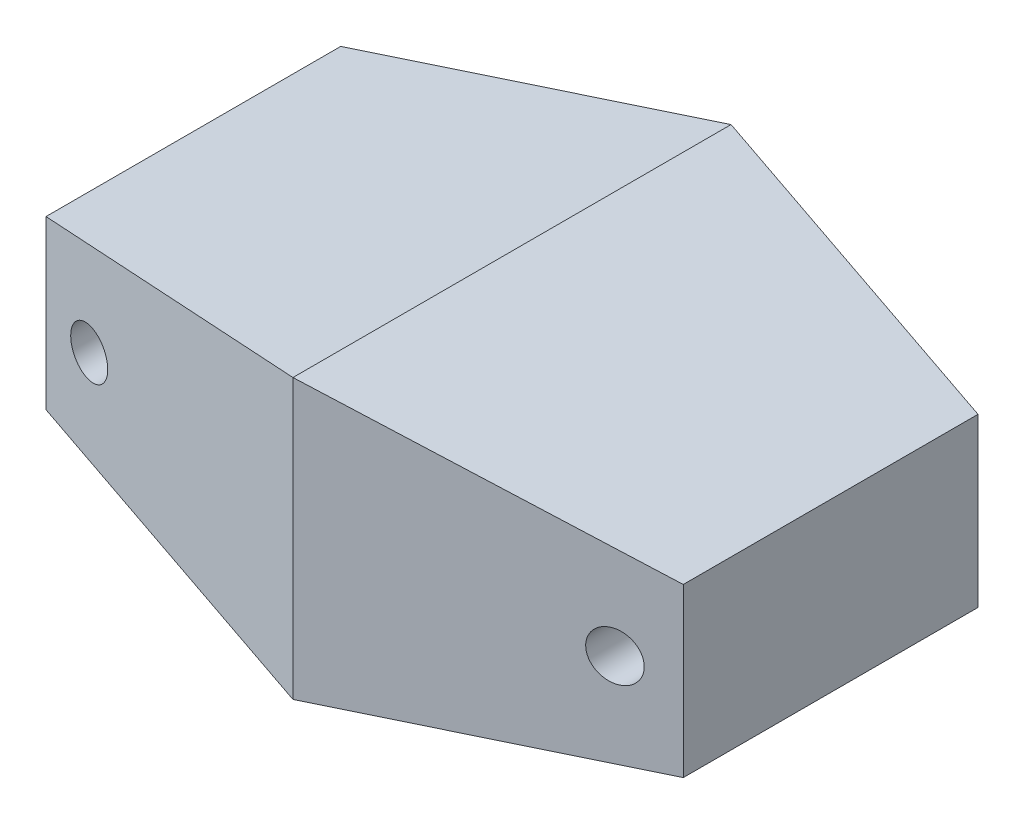
ISO-10303-21;
HEADER;
FILE_DESCRIPTION(('STEP AP214'),'2;1');
FILE_NAME('part.step','',(''),(''),'','','');
FILE_SCHEMA(('AUTOMOTIVE_DESIGN { 1 0 10303 214 1 1 1 1 }'));
ENDSEC;
DATA;
#1=APPLICATION_CONTEXT('core data for automotive mechanical design processes');
#2=APPLICATION_PROTOCOL_DEFINITION('international standard','automotive_design',2000,#1);
#3=PRODUCT_CONTEXT('',#1,'mechanical');
#4=PRODUCT('Part','Part','',(#3));
#5=PRODUCT_RELATED_PRODUCT_CATEGORY('part','',(#4));
#6=PRODUCT_DEFINITION_FORMATION('','',#4);
#7=PRODUCT_DEFINITION_CONTEXT('part definition',#1,'design');
#8=PRODUCT_DEFINITION('design','',#6,#7);
#9=PRODUCT_DEFINITION_SHAPE('','',#8);
#10=(LENGTH_UNIT() NAMED_UNIT(*) SI_UNIT(.MILLI.,.METRE.));
#11=(NAMED_UNIT(*) PLANE_ANGLE_UNIT() SI_UNIT($,.RADIAN.));
#12=(NAMED_UNIT(*) SI_UNIT($,.STERADIAN.) SOLID_ANGLE_UNIT());
#13=UNCERTAINTY_MEASURE_WITH_UNIT(LENGTH_MEASURE(1.E-05),#10,'distance_accuracy_value','');
#14=(GEOMETRIC_REPRESENTATION_CONTEXT(3) GLOBAL_UNCERTAINTY_ASSIGNED_CONTEXT((#13)) GLOBAL_UNIT_ASSIGNED_CONTEXT((#10,
#11,#12)) REPRESENTATION_CONTEXT('',''));
#15=CARTESIAN_POINT('',(0.,0.,0.));
#16=DIRECTION('',(0.,0.,1.));
#17=DIRECTION('',(1.,0.,0.));
#18=AXIS2_PLACEMENT_3D('',#15,#16,#17);
#19=CARTESIAN_POINT('',(40.,-17.5,55.));
#20=DIRECTION('',(-1.,0.,0.));
#21=DIRECTION('',(0.,0.,1.));
#22=AXIS2_PLACEMENT_3D('',#19,#20,#21);
#23=PLANE('',#22);
#24=DIRECTION('',(0.,1.,0.));
#25=VECTOR('',#24,1.);
#26=CARTESIAN_POINT('',(40.,-37.5,46.));
#27=LINE('',#26,#25);
#28=CARTESIAN_POINT('',(40.,-10.5,46.));
#29=VERTEX_POINT('',#28);
#30=CARTESIAN_POINT('',(40.,10.5,46.));
#31=VERTEX_POINT('',#30);
#32=EDGE_CURVE('E305',#29,#31,#27,.T.);
#33=ORIENTED_EDGE('',*,*,#32,.F.);
#34=DIRECTION('',(0.,0.,-1.));
#35=VECTOR('',#34,1.);
#36=CARTESIAN_POINT('',(40.,-10.5,55.));
#37=LINE('',#36,#35);
#38=CARTESIAN_POINT('',(40.,-10.5,9.00000000000001));
#39=VERTEX_POINT('',#38);
#40=EDGE_CURVE('E272',#29,#39,#37,.T.);
#41=ORIENTED_EDGE('',*,*,#40,.T.);
#42=DIRECTION('',(0.,1.,0.));
#43=VECTOR('',#42,1.);
#44=CARTESIAN_POINT('',(40.,-37.5,9.00000000000001));
#45=LINE('',#44,#43);
#46=CARTESIAN_POINT('',(40.,10.5,9.00000000000001));
#47=VERTEX_POINT('',#46);
#48=EDGE_CURVE('E165',#39,#47,#45,.T.);
#49=ORIENTED_EDGE('',*,*,#48,.T.);
#50=DIRECTION('',(0.,0.,-1.));
#51=VECTOR('',#50,1.);
#52=CARTESIAN_POINT('',(40.,10.5,55.));
#53=LINE('',#52,#51);
#54=EDGE_CURVE('E216',#31,#47,#53,.T.);
#55=ORIENTED_EDGE('',*,*,#54,.F.);
#56=EDGE_LOOP('',(#33,#41,#49,#55));
#57=FACE_BOUND('',#56,.T.);
#58=ADVANCED_FACE('F148',(#57),#23,.F.);
#59=CARTESIAN_POINT('',(-40.,-17.5,55.));
#60=DIRECTION('',(1.,0.,0.));
#61=DIRECTION('',(0.,0.,-1.));
#62=AXIS2_PLACEMENT_3D('',#59,#60,#61);
#63=PLANE('',#62);
#64=DIRECTION('',(0.,1.,0.));
#65=VECTOR('',#64,1.);
#66=CARTESIAN_POINT('',(-40.,-37.5,46.));
#67=LINE('',#66,#65);
#68=CARTESIAN_POINT('',(-40.,-10.5,46.));
#69=VERTEX_POINT('',#68);
#70=CARTESIAN_POINT('',(-40.,10.5,46.));
#71=VERTEX_POINT('',#70);
#72=EDGE_CURVE('E238',#69,#71,#67,.T.);
#73=ORIENTED_EDGE('',*,*,#72,.T.);
#74=DIRECTION('',(0.,0.,-1.));
#75=VECTOR('',#74,1.);
#76=CARTESIAN_POINT('',(-40.,10.5,55.));
#77=LINE('',#76,#75);
#78=CARTESIAN_POINT('',(-40.,10.5,8.99999999999999));
#79=VERTEX_POINT('',#78);
#80=EDGE_CURVE('E269',#71,#79,#77,.T.);
#81=ORIENTED_EDGE('',*,*,#80,.T.);
#82=DIRECTION('',(0.,1.,0.));
#83=VECTOR('',#82,1.);
#84=CARTESIAN_POINT('',(-40.,-37.5,8.99999999999999));
#85=LINE('',#84,#83);
#86=CARTESIAN_POINT('',(-40.,-10.5,8.99999999999999));
#87=VERTEX_POINT('',#86);
#88=EDGE_CURVE('E226',#87,#79,#85,.T.);
#89=ORIENTED_EDGE('',*,*,#88,.F.);
#90=DIRECTION('',(0.,0.,-1.));
#91=VECTOR('',#90,1.);
#92=CARTESIAN_POINT('',(-40.,-10.5,55.));
#93=LINE('',#92,#91);
#94=EDGE_CURVE('E228',#69,#87,#93,.T.);
#95=ORIENTED_EDGE('',*,*,#94,.F.);
#96=EDGE_LOOP('',(#73,#81,#89,#95));
#97=FACE_BOUND('',#96,.T.);
#98=ADVANCED_FACE('F316',(#97),#63,.F.);
#99=CARTESIAN_POINT('',(0.,-37.5,0.));
#100=DIRECTION('',(-0.219512195121951,0.,-0.975609756097561));
#101=DIRECTION('',(-0.975609756097561,0.,0.219512195121951));
#102=AXIS2_PLACEMENT_3D('',#99,#100,#101);
#103=PLANE('',#102);
#104=CARTESIAN_POINT('',(-33.,0.,7.42499999999999));
#105=DIRECTION('',(-0.219512195121951,0.,-0.975609756097561));
#106=DIRECTION('',(-0.975609756097561,0.,0.219512195121951));
#107=AXIS2_PLACEMENT_3D('',#104,#105,#106);
#108=ELLIPSE('',#107,3.075,3.);
#109=CARTESIAN_POINT('',(-36.,0.,8.09999999999999));
#110=VERTEX_POINT('',#109);
#111=EDGE_CURVE('E263',#110,#110,#108,.T.);
#112=ORIENTED_EDGE('',*,*,#111,.F.);
#113=EDGE_LOOP('',(#112));
#114=FACE_BOUND('',#113,.T.);
#115=DIRECTION('',(-0.96169407366869,-0.168296462892021,0.216381166575455));
#116=VECTOR('',#115,1.);
#117=CARTESIAN_POINT('',(-8.90173410404625,15.9421965317919,2.0028901734104));
#118=LINE('',#117,#116);
#119=CARTESIAN_POINT('',(0.,17.5,0.));
#120=VERTEX_POINT('',#119);
#121=EDGE_CURVE('E207',#120,#79,#118,.T.);
#122=ORIENTED_EDGE('',*,*,#121,.F.);
#123=DIRECTION('',(0.,1.,0.));
#124=VECTOR('',#123,1.);
#125=CARTESIAN_POINT('',(0.,0.,0.));
#126=LINE('',#125,#124);
#127=CARTESIAN_POINT('',(0.,-17.5,0.));
#128=VERTEX_POINT('',#127);
#129=EDGE_CURVE('E224',#128,#120,#126,.T.);
#130=ORIENTED_EDGE('',*,*,#129,.F.);
#131=DIRECTION('',(-0.96169407366869,0.16829646289202,0.216381166575455));
#132=VECTOR('',#131,1.);
#133=CARTESIAN_POINT('',(3.23699421965317,-18.0664739884393,-0.728323699421962));
#134=LINE('',#133,#132);
#135=EDGE_CURVE('E297',#128,#87,#134,.T.);
#136=ORIENTED_EDGE('',*,*,#135,.T.);
#137=ORIENTED_EDGE('',*,*,#88,.T.);
#138=EDGE_LOOP('',(#122,#130,#136,#137));
#139=FACE_BOUND('',#138,.T.);
#140=ADVANCED_FACE('F221',(#114,#139),#103,.T.);
#141=CARTESIAN_POINT('',(-11.7787031528852,-37.5,52.3497917906008));
#142=DIRECTION('',(0.219512195121951,0.,-0.975609756097561));
#143=DIRECTION('',(-0.975609756097561,0.,-0.219512195121951));
#144=AXIS2_PLACEMENT_3D('',#141,#142,#143);
#145=PLANE('',#144);
#146=CARTESIAN_POINT('',(-33.,0.,47.575));
#147=DIRECTION('',(0.219512195121951,0.,-0.975609756097561));
#148=DIRECTION('',(0.975609756097561,0.,0.219512195121951));
#149=AXIS2_PLACEMENT_3D('',#146,#147,#148);
#150=ELLIPSE('',#149,3.075,3.);
#151=CARTESIAN_POINT('',(-30.,0.,48.25));
#152=VERTEX_POINT('',#151);
#153=EDGE_CURVE('E151',#152,#152,#150,.T.);
#154=ORIENTED_EDGE('',*,*,#153,.T.);
#155=EDGE_LOOP('',(#154));
#156=FACE_BOUND('',#155,.T.);
#157=DIRECTION('',(0.,-1.,0.));
#158=VECTOR('',#157,1.);
#159=CARTESIAN_POINT('',(0.,0.,55.));
#160=LINE('',#159,#158);
#161=CARTESIAN_POINT('',(0.,17.5,55.));
#162=VERTEX_POINT('',#161);
#163=CARTESIAN_POINT('',(0.,-17.5,55.));
#164=VERTEX_POINT('',#163);
#165=EDGE_CURVE('E157',#162,#164,#160,.T.);
#166=ORIENTED_EDGE('',*,*,#165,.F.);
#167=DIRECTION('',(-0.96169407366869,-0.168296462892021,-0.216381166575455));
#168=VECTOR('',#167,1.);
#169=CARTESIAN_POINT('',(-20.3468208092486,13.9393063583815,50.4219653179191));
#170=LINE('',#169,#168);
#171=EDGE_CURVE('E210',#162,#71,#170,.T.);
#172=ORIENTED_EDGE('',*,*,#171,.T.);
#173=ORIENTED_EDGE('',*,*,#72,.F.);
#174=DIRECTION('',(-0.96169407366869,0.16829646289202,-0.216381166575455));
#175=VECTOR('',#174,1.);
#176=CARTESIAN_POINT('',(-8.20809248554913,-16.0635838150289,53.1531791907515));
#177=LINE('',#176,#175);
#178=EDGE_CURVE('E215',#164,#69,#177,.T.);
#179=ORIENTED_EDGE('',*,*,#178,.F.);
#180=EDGE_LOOP('',(#166,#172,#173,#179));
#181=FACE_BOUND('',#180,.T.);
#182=ADVANCED_FACE('F325',(#156,#181),#145,.F.);
#183=CARTESIAN_POINT('',(11.7787031528852,-37.5,52.3497917906008));
#184=DIRECTION('',(0.219512195121951,0.,0.975609756097561));
#185=DIRECTION('',(0.975609756097561,0.,-0.219512195121951));
#186=AXIS2_PLACEMENT_3D('',#183,#184,#185);
#187=PLANE('',#186);
#188=CARTESIAN_POINT('',(33.0000000000001,0.,47.575));
#189=DIRECTION('',(0.219512195121951,0.,0.975609756097561));
#190=DIRECTION('',(-0.975609756097561,0.,0.219512195121951));
#191=AXIS2_PLACEMENT_3D('',#188,#189,#190);
#192=ELLIPSE('',#191,3.075,3.);
#193=CARTESIAN_POINT('',(30.0000000000001,0.,48.25));
#194=VERTEX_POINT('',#193);
#195=EDGE_CURVE('E253',#194,#194,#192,.T.);
#196=ORIENTED_EDGE('',*,*,#195,.F.);
#197=EDGE_LOOP('',(#196));
#198=FACE_BOUND('',#197,.T.);
#199=DIRECTION('',(-0.96169407366869,-0.168296462892021,0.216381166575455));
#200=VECTOR('',#199,1.);
#201=CARTESIAN_POINT('',(8.20809248554913,-16.0635838150289,53.1531791907514));
#202=LINE('',#201,#200);
#203=EDGE_CURVE('E173',#29,#164,#202,.T.);
#204=ORIENTED_EDGE('',*,*,#203,.F.);
#205=ORIENTED_EDGE('',*,*,#32,.T.);
#206=DIRECTION('',(-0.96169407366869,0.168296462892021,0.216381166575455));
#207=VECTOR('',#206,1.);
#208=CARTESIAN_POINT('',(20.3468208092486,13.9393063583815,50.4219653179191));
#209=LINE('',#208,#207);
#210=EDGE_CURVE('E300',#31,#162,#209,.T.);
#211=ORIENTED_EDGE('',*,*,#210,.T.);
#212=ORIENTED_EDGE('',*,*,#165,.T.);
#213=EDGE_LOOP('',(#204,#205,#211,#212));
#214=FACE_BOUND('',#213,.T.);
#215=ADVANCED_FACE('F313',(#198,#214),#187,.T.);
#216=CARTESIAN_POINT('',(0.,-37.5,0.));
#217=DIRECTION('',(-0.219512195121951,0.,0.975609756097561));
#218=DIRECTION('',(0.975609756097561,0.,0.219512195121951));
#219=AXIS2_PLACEMENT_3D('',#216,#217,#218);
#220=PLANE('',#219);
#221=CARTESIAN_POINT('',(33.0000000000001,0.,7.42500000000003));
#222=DIRECTION('',(-0.219512195121951,0.,0.975609756097561));
#223=DIRECTION('',(0.975609756097561,0.,0.219512195121951));
#224=AXIS2_PLACEMENT_3D('',#221,#222,#223);
#225=ELLIPSE('',#224,3.075,3.);
#226=CARTESIAN_POINT('',(36.0000000000001,0.,8.10000000000003));
#227=VERTEX_POINT('',#226);
#228=EDGE_CURVE('E250',#227,#227,#225,.T.);
#229=ORIENTED_EDGE('',*,*,#228,.T.);
#230=EDGE_LOOP('',(#229));
#231=FACE_BOUND('',#230,.T.);
#232=ORIENTED_EDGE('',*,*,#48,.F.);
#233=DIRECTION('',(-0.96169407366869,-0.168296462892021,-0.216381166575455));
#234=VECTOR('',#233,1.);
#235=CARTESIAN_POINT('',(-3.23699421965318,-18.0664739884393,-0.728323699421965));
#236=LINE('',#235,#234);
#237=EDGE_CURVE('E235',#39,#128,#236,.T.);
#238=ORIENTED_EDGE('',*,*,#237,.T.);
#239=ORIENTED_EDGE('',*,*,#129,.T.);
#240=DIRECTION('',(-0.96169407366869,0.168296462892021,-0.216381166575455));
#241=VECTOR('',#240,1.);
#242=CARTESIAN_POINT('',(8.90173410404627,15.9421965317919,2.00289017341041));
#243=LINE('',#242,#241);
#244=EDGE_CURVE('E12',#47,#120,#243,.T.);
#245=ORIENTED_EDGE('',*,*,#244,.F.);
#246=EDGE_LOOP('',(#232,#238,#239,#245));
#247=FACE_BOUND('',#246,.T.);
#248=ADVANCED_FACE('F234',(#231,#247),#220,.F.);
#249=CARTESIAN_POINT('',(2.97149787750153,16.9799878714373,55.));
#250=DIRECTION('',(0.172380331752249,0.985030467155704,0.));
#251=DIRECTION('',(-0.985030467155704,0.172380331752249,0.));
#252=AXIS2_PLACEMENT_3D('',#249,#250,#251);
#253=PLANE('',#252);
#254=ORIENTED_EDGE('',*,*,#54,.T.);
#255=ORIENTED_EDGE('',*,*,#244,.T.);
#256=DIRECTION('',(0.,0.,-1.));
#257=VECTOR('',#256,1.);
#258=CARTESIAN_POINT('',(0.,17.5,55.));
#259=LINE('',#258,#257);
#260=EDGE_CURVE('E204',#162,#120,#259,.T.);
#261=ORIENTED_EDGE('',*,*,#260,.F.);
#262=ORIENTED_EDGE('',*,*,#210,.F.);
#263=EDGE_LOOP('',(#254,#255,#261,#262));
#264=FACE_BOUND('',#263,.T.);
#265=ADVANCED_FACE('F231',(#264),#253,.T.);
#266=CARTESIAN_POINT('',(-2.9714978775015,-16.9799878714372,55.));
#267=DIRECTION('',(-0.172380331752247,-0.985030467155704,0.));
#268=DIRECTION('',(0.985030467155704,-0.172380331752247,0.));
#269=AXIS2_PLACEMENT_3D('',#266,#267,#268);
#270=PLANE('',#269);
#271=DIRECTION('',(0.,0.,-1.));
#272=VECTOR('',#271,1.);
#273=CARTESIAN_POINT('',(0.,-17.5,55.));
#274=LINE('',#273,#272);
#275=EDGE_CURVE('E268',#164,#128,#274,.T.);
#276=ORIENTED_EDGE('',*,*,#275,.F.);
#277=ORIENTED_EDGE('',*,*,#178,.T.);
#278=ORIENTED_EDGE('',*,*,#94,.T.);
#279=ORIENTED_EDGE('',*,*,#135,.F.);
#280=EDGE_LOOP('',(#276,#277,#278,#279));
#281=FACE_BOUND('',#280,.T.);
#282=ADVANCED_FACE('F337',(#281),#270,.T.);
#283=CARTESIAN_POINT('',(2.97149787750152,-16.9799878714372,55.));
#284=DIRECTION('',(-0.172380331752248,0.985030467155704,0.));
#285=DIRECTION('',(-0.985030467155704,-0.172380331752248,0.));
#286=AXIS2_PLACEMENT_3D('',#283,#284,#285);
#287=PLANE('',#286);
#288=ORIENTED_EDGE('',*,*,#203,.T.);
#289=ORIENTED_EDGE('',*,*,#275,.T.);
#290=ORIENTED_EDGE('',*,*,#237,.F.);
#291=ORIENTED_EDGE('',*,*,#40,.F.);
#292=EDGE_LOOP('',(#288,#289,#290,#291));
#293=FACE_BOUND('',#292,.T.);
#294=ADVANCED_FACE('F340',(#293),#287,.F.);
#295=CARTESIAN_POINT('',(-2.97149787750152,16.9799878714372,55.));
#296=DIRECTION('',(0.172380331752248,-0.985030467155704,0.));
#297=DIRECTION('',(0.985030467155704,0.172380331752248,0.));
#298=AXIS2_PLACEMENT_3D('',#295,#296,#297);
#299=PLANE('',#298);
#300=ORIENTED_EDGE('',*,*,#121,.T.);
#301=ORIENTED_EDGE('',*,*,#80,.F.);
#302=ORIENTED_EDGE('',*,*,#171,.F.);
#303=ORIENTED_EDGE('',*,*,#260,.T.);
#304=EDGE_LOOP('',(#300,#301,#302,#303));
#305=FACE_BOUND('',#304,.T.);
#306=ADVANCED_FACE('F206',(#305),#299,.F.);
#307=CARTESIAN_POINT('',(33.0000000000001,0.,-5.5E-05));
#308=DIRECTION('',(0.,0.,1.));
#309=DIRECTION('',(1.,0.,0.));
#310=AXIS2_PLACEMENT_3D('',#307,#308,#309);
#311=CYLINDRICAL_SURFACE('',#310,3.);
#312=ORIENTED_EDGE('',*,*,#195,.T.);
#313=EDGE_LOOP('',(#312));
#314=FACE_BOUND('',#313,.T.);
#315=ORIENTED_EDGE('',*,*,#228,.F.);
#316=EDGE_LOOP('',(#315));
#317=FACE_BOUND('',#316,.T.);
#318=ADVANCED_FACE('F348',(#314,#317),#311,.F.);
#319=CARTESIAN_POINT('',(-33.,0.,-5.5E-05));
#320=DIRECTION('',(0.,0.,1.));
#321=DIRECTION('',(1.,0.,0.));
#322=AXIS2_PLACEMENT_3D('',#319,#320,#321);
#323=CYLINDRICAL_SURFACE('',#322,3.);
#324=ORIENTED_EDGE('',*,*,#111,.T.);
#325=EDGE_LOOP('',(#324));
#326=FACE_BOUND('',#325,.T.);
#327=ORIENTED_EDGE('',*,*,#153,.F.);
#328=EDGE_LOOP('',(#327));
#329=FACE_BOUND('',#328,.T.);
#330=ADVANCED_FACE('F351',(#326,#329),#323,.F.);
#331=CLOSED_SHELL('',(#58,#98,#140,#182,#215,#248,#265,#282,#294,#306,#318,#330));
#332=MANIFOLD_SOLID_BREP('B2',#331);
#333=ADVANCED_BREP_SHAPE_REPRESENTATION('',(#18,#332),#14);
#334=SHAPE_DEFINITION_REPRESENTATION(#9,#333);
ENDSEC;
END-ISO-10303-21;
